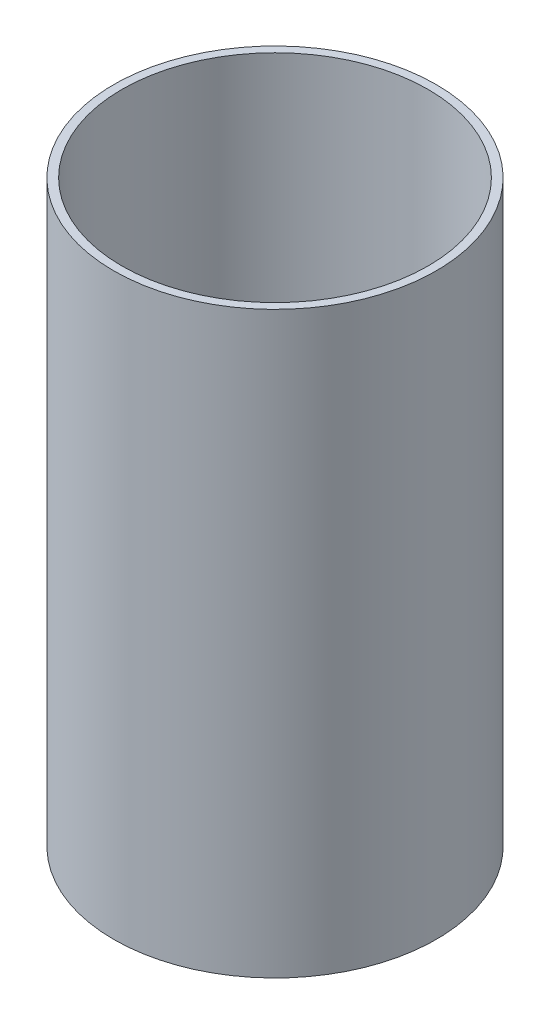
ISO-10303-21;
HEADER;
FILE_DESCRIPTION(('STEP AP214'),'2;1');
FILE_NAME('part.step','',(''),(''),'','','');
FILE_SCHEMA(('AUTOMOTIVE_DESIGN { 1 0 10303 214 1 1 1 1 }'));
ENDSEC;
DATA;
#1=APPLICATION_CONTEXT('core data for automotive mechanical design processes');
#2=APPLICATION_PROTOCOL_DEFINITION('international standard','automotive_design',2000,#1);
#3=PRODUCT_CONTEXT('',#1,'mechanical');
#4=PRODUCT('Part','Part','',(#3));
#5=PRODUCT_RELATED_PRODUCT_CATEGORY('part','',(#4));
#6=PRODUCT_DEFINITION_FORMATION('','',#4);
#7=PRODUCT_DEFINITION_CONTEXT('part definition',#1,'design');
#8=PRODUCT_DEFINITION('design','',#6,#7);
#9=PRODUCT_DEFINITION_SHAPE('','',#8);
#10=(LENGTH_UNIT() NAMED_UNIT(*) SI_UNIT(.MILLI.,.METRE.));
#11=(NAMED_UNIT(*) PLANE_ANGLE_UNIT() SI_UNIT($,.RADIAN.));
#12=(NAMED_UNIT(*) SI_UNIT($,.STERADIAN.) SOLID_ANGLE_UNIT());
#13=UNCERTAINTY_MEASURE_WITH_UNIT(LENGTH_MEASURE(1.E-05),#10,'distance_accuracy_value','');
#14=(GEOMETRIC_REPRESENTATION_CONTEXT(3) GLOBAL_UNCERTAINTY_ASSIGNED_CONTEXT((#13)) GLOBAL_UNIT_ASSIGNED_CONTEXT((#10,
#11,#12)) REPRESENTATION_CONTEXT('',''));
#15=CARTESIAN_POINT('',(0.,0.,0.));
#16=DIRECTION('',(0.,0.,1.));
#17=DIRECTION('',(1.,0.,0.));
#18=AXIS2_PLACEMENT_3D('',#15,#16,#17);
#19=CARTESIAN_POINT('',(0.,177.8,0.));
#20=DIRECTION('',(0.,1.,0.));
#21=DIRECTION('',(0.,0.,1.));
#22=AXIS2_PLACEMENT_3D('',#19,#20,#21);
#23=PLANE('',#22);
#24=CARTESIAN_POINT('',(0.,177.8,0.));
#25=DIRECTION('',(0.,1.,0.));
#26=DIRECTION('',(0.,0.,1.));
#27=AXIS2_PLACEMENT_3D('',#24,#25,#26);
#28=CIRCLE('',#27,49.53);
#29=CARTESIAN_POINT('',(0.,177.8,49.53));
#30=VERTEX_POINT('',#29);
#31=EDGE_CURVE('E10',#30,#30,#28,.T.);
#32=ORIENTED_EDGE('',*,*,#31,.T.);
#33=EDGE_LOOP('',(#32));
#34=FACE_BOUND('',#33,.T.);
#35=CARTESIAN_POINT('',(0.,177.8,0.));
#36=DIRECTION('',(0.,1.,0.));
#37=DIRECTION('',(0.,0.,1.));
#38=AXIS2_PLACEMENT_3D('',#35,#36,#37);
#39=CIRCLE('',#38,46.99);
#40=CARTESIAN_POINT('',(0.,177.8,46.99));
#41=VERTEX_POINT('',#40);
#42=EDGE_CURVE('E45',#41,#41,#39,.T.);
#43=ORIENTED_EDGE('',*,*,#42,.F.);
#44=EDGE_LOOP('',(#43));
#45=FACE_BOUND('',#44,.T.);
#46=ADVANCED_FACE('F34',(#34,#45),#23,.T.);
#47=CARTESIAN_POINT('',(0.,0.,0.));
#48=DIRECTION('',(0.,1.,0.));
#49=DIRECTION('',(0.,0.,1.));
#50=AXIS2_PLACEMENT_3D('',#47,#48,#49);
#51=PLANE('',#50);
#52=CARTESIAN_POINT('',(0.,0.,0.));
#53=DIRECTION('',(0.,1.,0.));
#54=DIRECTION('',(0.,0.,1.));
#55=AXIS2_PLACEMENT_3D('',#52,#53,#54);
#56=CIRCLE('',#55,49.53);
#57=CARTESIAN_POINT('',(0.,0.,49.53));
#58=VERTEX_POINT('',#57);
#59=EDGE_CURVE('E38',#58,#58,#56,.T.);
#60=ORIENTED_EDGE('',*,*,#59,.F.);
#61=EDGE_LOOP('',(#60));
#62=FACE_BOUND('',#61,.T.);
#63=CARTESIAN_POINT('',(0.,0.,0.));
#64=DIRECTION('',(0.,1.,0.));
#65=DIRECTION('',(0.,0.,1.));
#66=AXIS2_PLACEMENT_3D('',#63,#64,#65);
#67=CIRCLE('',#66,46.99);
#68=CARTESIAN_POINT('',(0.,0.,46.99));
#69=VERTEX_POINT('',#68);
#70=EDGE_CURVE('E47',#69,#69,#67,.T.);
#71=ORIENTED_EDGE('',*,*,#70,.T.);
#72=EDGE_LOOP('',(#71));
#73=FACE_BOUND('',#72,.T.);
#74=ADVANCED_FACE('F57',(#62,#73),#51,.F.);
#75=CARTESIAN_POINT('',(0.,177.8,0.));
#76=DIRECTION('',(0.,-1.,0.));
#77=DIRECTION('',(0.,0.,-1.));
#78=AXIS2_PLACEMENT_3D('',#75,#76,#77);
#79=CYLINDRICAL_SURFACE('',#78,49.53);
#80=ORIENTED_EDGE('',*,*,#31,.F.);
#81=EDGE_LOOP('',(#80));
#82=FACE_BOUND('',#81,.T.);
#83=ORIENTED_EDGE('',*,*,#59,.T.);
#84=EDGE_LOOP('',(#83));
#85=FACE_BOUND('',#84,.T.);
#86=ADVANCED_FACE('F36',(#82,#85),#79,.T.);
#87=CARTESIAN_POINT('',(0.,177.8,0.));
#88=DIRECTION('',(0.,-1.,0.));
#89=DIRECTION('',(0.,0.,-1.));
#90=AXIS2_PLACEMENT_3D('',#87,#88,#89);
#91=CYLINDRICAL_SURFACE('',#90,46.99);
#92=ORIENTED_EDGE('',*,*,#42,.T.);
#93=EDGE_LOOP('',(#92));
#94=FACE_BOUND('',#93,.T.);
#95=ORIENTED_EDGE('',*,*,#70,.F.);
#96=EDGE_LOOP('',(#95));
#97=FACE_BOUND('',#96,.T.);
#98=ADVANCED_FACE('F53',(#94,#97),#91,.F.);
#99=CLOSED_SHELL('',(#46,#74,#86,#98));
#100=MANIFOLD_SOLID_BREP('B2',#99);
#101=ADVANCED_BREP_SHAPE_REPRESENTATION('',(#18,#100),#14);
#102=SHAPE_DEFINITION_REPRESENTATION(#9,#101);
ENDSEC;
END-ISO-10303-21;
